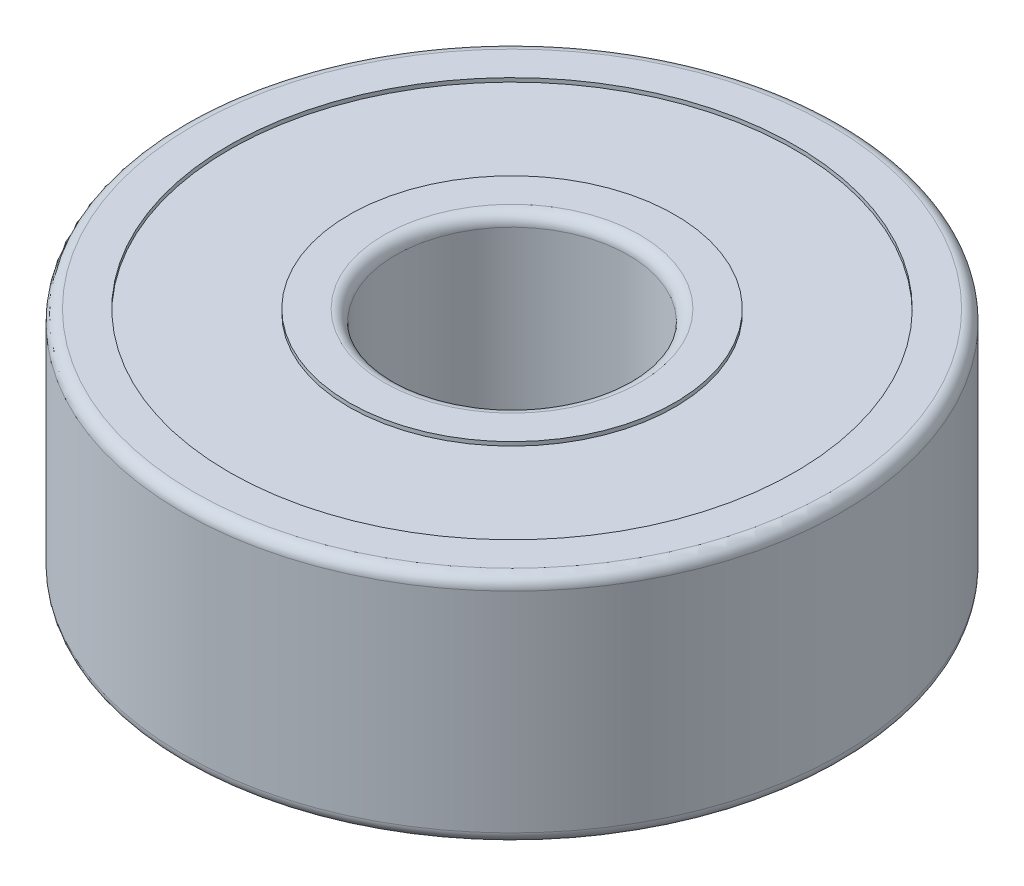
ISO-10303-21;
HEADER;
FILE_DESCRIPTION(('STEP AP214'),'2;1');
FILE_NAME('part.step','',(''),(''),'','','');
FILE_SCHEMA(('AUTOMOTIVE_DESIGN { 1 0 10303 214 1 1 1 1 }'));
ENDSEC;
DATA;
#1=APPLICATION_CONTEXT('core data for automotive mechanical design processes');
#2=APPLICATION_PROTOCOL_DEFINITION('international standard','automotive_design',2000,#1);
#3=PRODUCT_CONTEXT('',#1,'mechanical');
#4=PRODUCT('Part','Part','',(#3));
#5=PRODUCT_RELATED_PRODUCT_CATEGORY('part','',(#4));
#6=PRODUCT_DEFINITION_FORMATION('','',#4);
#7=PRODUCT_DEFINITION_CONTEXT('part definition',#1,'design');
#8=PRODUCT_DEFINITION('design','',#6,#7);
#9=PRODUCT_DEFINITION_SHAPE('','',#8);
#10=(LENGTH_UNIT() NAMED_UNIT(*) SI_UNIT(.MILLI.,.METRE.));
#11=(NAMED_UNIT(*) PLANE_ANGLE_UNIT() SI_UNIT($,.RADIAN.));
#12=(NAMED_UNIT(*) SI_UNIT($,.STERADIAN.) SOLID_ANGLE_UNIT());
#13=UNCERTAINTY_MEASURE_WITH_UNIT(LENGTH_MEASURE(1.E-05),#10,'distance_accuracy_value','');
#14=(GEOMETRIC_REPRESENTATION_CONTEXT(3) GLOBAL_UNCERTAINTY_ASSIGNED_CONTEXT((#13)) GLOBAL_UNIT_ASSIGNED_CONTEXT((#10,
#11,#12)) REPRESENTATION_CONTEXT('',''));
#15=CARTESIAN_POINT('',(0.,0.,0.));
#16=DIRECTION('',(0.,0.,1.));
#17=DIRECTION('',(1.,0.,0.));
#18=AXIS2_PLACEMENT_3D('',#15,#16,#17);
#19=CARTESIAN_POINT('',(0.,0.,0.));
#20=DIRECTION('',(0.,1.,0.));
#21=DIRECTION('',(0.,0.,1.));
#22=AXIS2_PLACEMENT_3D('',#19,#20,#21);
#23=PLANE('',#22);
#24=CARTESIAN_POINT('',(0.,0.,0.));
#25=DIRECTION('',(0.,1.,0.));
#26=DIRECTION('',(0.,0.,1.));
#27=AXIS2_PLACEMENT_3D('',#24,#25,#26);
#28=CIRCLE('',#27,3.3);
#29=CARTESIAN_POINT('',(0.,0.,3.3));
#30=VERTEX_POINT('',#29);
#31=EDGE_CURVE('E57',#30,#30,#28,.T.);
#32=ORIENTED_EDGE('',*,*,#31,.T.);
#33=EDGE_LOOP('',(#32));
#34=FACE_BOUND('',#33,.T.);
#35=CARTESIAN_POINT('',(0.,0.,0.));
#36=DIRECTION('',(0.,1.,0.));
#37=DIRECTION('',(0.,0.,1.));
#38=AXIS2_PLACEMENT_3D('',#35,#36,#37);
#39=CIRCLE('',#38,4.2);
#40=CARTESIAN_POINT('',(0.,0.,4.2));
#41=VERTEX_POINT('',#40);
#42=EDGE_CURVE('E88',#41,#41,#39,.T.);
#43=ORIENTED_EDGE('',*,*,#42,.F.);
#44=EDGE_LOOP('',(#43));
#45=FACE_BOUND('',#44,.T.);
#46=ADVANCED_FACE('F37',(#34,#45),#23,.F.);
#47=CARTESIAN_POINT('',(0.,6.,0.));
#48=DIRECTION('',(0.,1.,0.));
#49=DIRECTION('',(0.,0.,1.));
#50=AXIS2_PLACEMENT_3D('',#47,#48,#49);
#51=PLANE('',#50);
#52=CARTESIAN_POINT('',(0.,6.,0.));
#53=DIRECTION('',(0.,1.,0.));
#54=DIRECTION('',(0.,0.,1.));
#55=AXIS2_PLACEMENT_3D('',#52,#53,#54);
#56=CIRCLE('',#55,3.3);
#57=CARTESIAN_POINT('',(0.,6.,3.3));
#58=VERTEX_POINT('',#57);
#59=EDGE_CURVE('E60',#58,#58,#56,.F.);
#60=ORIENTED_EDGE('',*,*,#59,.T.);
#61=EDGE_LOOP('',(#60));
#62=FACE_BOUND('',#61,.T.);
#63=CARTESIAN_POINT('',(0.,6.,0.));
#64=DIRECTION('',(0.,1.,0.));
#65=DIRECTION('',(0.,0.,1.));
#66=AXIS2_PLACEMENT_3D('',#63,#64,#65);
#67=CIRCLE('',#66,4.2);
#68=CARTESIAN_POINT('',(0.,6.,4.2));
#69=VERTEX_POINT('',#68);
#70=EDGE_CURVE('E76',#69,#69,#67,.T.);
#71=ORIENTED_EDGE('',*,*,#70,.T.);
#72=EDGE_LOOP('',(#71));
#73=FACE_BOUND('',#72,.T.);
#74=ADVANCED_FACE('F105',(#62,#73),#51,.T.);
#75=CARTESIAN_POINT('',(0.,6.,0.));
#76=DIRECTION('',(0.,1.,0.));
#77=DIRECTION('',(0.,0.,1.));
#78=AXIS2_PLACEMENT_3D('',#75,#76,#77);
#79=CIRCLE('',#78,8.2);
#80=CARTESIAN_POINT('',(0.,6.,8.2));
#81=VERTEX_POINT('',#80);
#82=EDGE_CURVE('E10',#81,#81,#79,.T.);
#83=ORIENTED_EDGE('',*,*,#82,.T.);
#84=EDGE_LOOP('',(#83));
#85=FACE_BOUND('',#84,.T.);
#86=CARTESIAN_POINT('',(0.,6.,0.));
#87=DIRECTION('',(0.,1.,0.));
#88=DIRECTION('',(0.,0.,1.));
#89=AXIS2_PLACEMENT_3D('',#86,#87,#88);
#90=CIRCLE('',#89,7.3);
#91=CARTESIAN_POINT('',(0.,6.,7.3));
#92=VERTEX_POINT('',#91);
#93=EDGE_CURVE('E70',#92,#92,#90,.T.);
#94=ORIENTED_EDGE('',*,*,#93,.F.);
#95=EDGE_LOOP('',(#94));
#96=FACE_BOUND('',#95,.T.);
#97=ADVANCED_FACE('F112',(#85,#96),#51,.T.);
#98=CARTESIAN_POINT('',(0.,0.,0.));
#99=DIRECTION('',(0.,1.,0.));
#100=DIRECTION('',(0.,0.,1.));
#101=AXIS2_PLACEMENT_3D('',#98,#99,#100);
#102=CIRCLE('',#101,8.2);
#103=CARTESIAN_POINT('',(0.,0.,8.2));
#104=VERTEX_POINT('',#103);
#105=EDGE_CURVE('E44',#104,#104,#102,.F.);
#106=ORIENTED_EDGE('',*,*,#105,.T.);
#107=EDGE_LOOP('',(#106));
#108=FACE_BOUND('',#107,.T.);
#109=CARTESIAN_POINT('',(0.,0.,0.));
#110=DIRECTION('',(0.,1.,0.));
#111=DIRECTION('',(0.,0.,1.));
#112=AXIS2_PLACEMENT_3D('',#109,#110,#111);
#113=CIRCLE('',#112,7.3);
#114=CARTESIAN_POINT('',(0.,0.,7.3));
#115=VERTEX_POINT('',#114);
#116=EDGE_CURVE('E82',#115,#115,#113,.T.);
#117=ORIENTED_EDGE('',*,*,#116,.T.);
#118=EDGE_LOOP('',(#117));
#119=FACE_BOUND('',#118,.T.);
#120=ADVANCED_FACE('F108',(#108,#119),#23,.F.);
#121=CARTESIAN_POINT('',(0.,6.,0.));
#122=DIRECTION('',(0.,-1.,0.));
#123=DIRECTION('',(0.,0.,-1.));
#124=AXIS2_PLACEMENT_3D('',#121,#122,#123);
#125=CYLINDRICAL_SURFACE('',#124,8.5);
#126=CARTESIAN_POINT('',(0.,0.3,0.));
#127=DIRECTION('',(0.,1.,0.));
#128=DIRECTION('',(0.,0.,1.));
#129=AXIS2_PLACEMENT_3D('',#126,#127,#128);
#130=CIRCLE('',#129,8.5);
#131=CARTESIAN_POINT('',(0.,0.3,8.5));
#132=VERTEX_POINT('',#131);
#133=EDGE_CURVE('E48',#132,#132,#130,.T.);
#134=ORIENTED_EDGE('',*,*,#133,.T.);
#135=EDGE_LOOP('',(#134));
#136=FACE_BOUND('',#135,.T.);
#137=CARTESIAN_POINT('',(0.,5.7,0.));
#138=DIRECTION('',(0.,1.,0.));
#139=DIRECTION('',(0.,0.,1.));
#140=AXIS2_PLACEMENT_3D('',#137,#138,#139);
#141=CIRCLE('',#140,8.5);
#142=CARTESIAN_POINT('',(0.,5.7,8.5));
#143=VERTEX_POINT('',#142);
#144=EDGE_CURVE('E52',#143,#143,#141,.F.);
#145=ORIENTED_EDGE('',*,*,#144,.T.);
#146=EDGE_LOOP('',(#145));
#147=FACE_BOUND('',#146,.T.);
#148=ADVANCED_FACE('F117',(#136,#147),#125,.T.);
#149=CARTESIAN_POINT('',(0.,6.,0.));
#150=DIRECTION('',(0.,-1.,0.));
#151=DIRECTION('',(0.,0.,-1.));
#152=AXIS2_PLACEMENT_3D('',#149,#150,#151);
#153=CYLINDRICAL_SURFACE('',#152,3.);
#154=CARTESIAN_POINT('',(0.,5.7,0.));
#155=DIRECTION('',(0.,1.,0.));
#156=DIRECTION('',(0.,0.,1.));
#157=AXIS2_PLACEMENT_3D('',#154,#155,#156);
#158=CIRCLE('',#157,3.);
#159=CARTESIAN_POINT('',(0.,5.7,3.));
#160=VERTEX_POINT('',#159);
#161=EDGE_CURVE('E63',#160,#160,#158,.T.);
#162=ORIENTED_EDGE('',*,*,#161,.T.);
#163=EDGE_LOOP('',(#162));
#164=FACE_BOUND('',#163,.T.);
#165=CARTESIAN_POINT('',(0.,0.3,0.));
#166=DIRECTION('',(0.,1.,0.));
#167=DIRECTION('',(0.,0.,1.));
#168=AXIS2_PLACEMENT_3D('',#165,#166,#167);
#169=CIRCLE('',#168,3.);
#170=CARTESIAN_POINT('',(0.,0.3,3.));
#171=VERTEX_POINT('',#170);
#172=EDGE_CURVE('E66',#171,#171,#169,.F.);
#173=ORIENTED_EDGE('',*,*,#172,.T.);
#174=EDGE_LOOP('',(#173));
#175=FACE_BOUND('',#174,.T.);
#176=ADVANCED_FACE('F122',(#164,#175),#153,.F.);
#177=CARTESIAN_POINT('',(0.,5.9,0.));
#178=DIRECTION('',(0.,1.,0.));
#179=DIRECTION('',(0.,0.,1.));
#180=AXIS2_PLACEMENT_3D('',#177,#178,#179);
#181=CYLINDRICAL_SURFACE('',#180,7.3);
#182=CARTESIAN_POINT('',(0.,5.9,0.));
#183=DIRECTION('',(0.,1.,0.));
#184=DIRECTION('',(0.,0.,1.));
#185=AXIS2_PLACEMENT_3D('',#182,#183,#184);
#186=CIRCLE('',#185,7.3);
#187=CARTESIAN_POINT('',(0.,5.9,7.3));
#188=VERTEX_POINT('',#187);
#189=EDGE_CURVE('E69',#188,#188,#186,.T.);
#190=ORIENTED_EDGE('',*,*,#189,.F.);
#191=EDGE_LOOP('',(#190));
#192=FACE_BOUND('',#191,.T.);
#193=ORIENTED_EDGE('',*,*,#93,.T.);
#194=EDGE_LOOP('',(#193));
#195=FACE_BOUND('',#194,.T.);
#196=ADVANCED_FACE('F143',(#192,#195),#181,.F.);
#197=CARTESIAN_POINT('',(0.,5.9,0.));
#198=DIRECTION('',(0.,1.,0.));
#199=DIRECTION('',(0.,0.,1.));
#200=AXIS2_PLACEMENT_3D('',#197,#198,#199);
#201=PLANE('',#200);
#202=CARTESIAN_POINT('',(0.,5.9,0.));
#203=DIRECTION('',(0.,1.,0.));
#204=DIRECTION('',(0.,0.,1.));
#205=AXIS2_PLACEMENT_3D('',#202,#203,#204);
#206=CIRCLE('',#205,4.2);
#207=CARTESIAN_POINT('',(0.,5.9,4.2));
#208=VERTEX_POINT('',#207);
#209=EDGE_CURVE('E73',#208,#208,#206,.T.);
#210=ORIENTED_EDGE('',*,*,#209,.F.);
#211=EDGE_LOOP('',(#210));
#212=FACE_BOUND('',#211,.T.);
#213=ORIENTED_EDGE('',*,*,#189,.T.);
#214=EDGE_LOOP('',(#213));
#215=FACE_BOUND('',#214,.T.);
#216=ADVANCED_FACE('F139',(#212,#215),#201,.T.);
#217=CARTESIAN_POINT('',(0.,5.9,0.));
#218=DIRECTION('',(0.,1.,0.));
#219=DIRECTION('',(0.,0.,1.));
#220=AXIS2_PLACEMENT_3D('',#217,#218,#219);
#221=CYLINDRICAL_SURFACE('',#220,4.2);
#222=ORIENTED_EDGE('',*,*,#209,.T.);
#223=EDGE_LOOP('',(#222));
#224=FACE_BOUND('',#223,.T.);
#225=ORIENTED_EDGE('',*,*,#70,.F.);
#226=EDGE_LOOP('',(#225));
#227=FACE_BOUND('',#226,.T.);
#228=ADVANCED_FACE('F133',(#224,#227),#221,.T.);
#229=CARTESIAN_POINT('',(0.,0.1,0.));
#230=DIRECTION('',(0.,-1.,0.));
#231=DIRECTION('',(0.,0.,1.));
#232=AXIS2_PLACEMENT_3D('',#229,#230,#231);
#233=PLANE('',#232);
#234=CARTESIAN_POINT('',(0.,0.1,0.));
#235=DIRECTION('',(0.,1.,0.));
#236=DIRECTION('',(0.,0.,1.));
#237=AXIS2_PLACEMENT_3D('',#234,#235,#236);
#238=CIRCLE('',#237,7.3);
#239=CARTESIAN_POINT('',(0.,0.1,7.3));
#240=VERTEX_POINT('',#239);
#241=EDGE_CURVE('E79',#240,#240,#238,.T.);
#242=ORIENTED_EDGE('',*,*,#241,.F.);
#243=EDGE_LOOP('',(#242));
#244=FACE_BOUND('',#243,.T.);
#245=CARTESIAN_POINT('',(0.,0.1,0.));
#246=DIRECTION('',(0.,1.,0.));
#247=DIRECTION('',(0.,0.,1.));
#248=AXIS2_PLACEMENT_3D('',#245,#246,#247);
#249=CIRCLE('',#248,4.2);
#250=CARTESIAN_POINT('',(0.,0.1,4.2));
#251=VERTEX_POINT('',#250);
#252=EDGE_CURVE('E85',#251,#251,#249,.T.);
#253=ORIENTED_EDGE('',*,*,#252,.T.);
#254=EDGE_LOOP('',(#253));
#255=FACE_BOUND('',#254,.T.);
#256=ADVANCED_FACE('F94',(#244,#255),#233,.T.);
#257=CARTESIAN_POINT('',(0.,0.1,0.));
#258=DIRECTION('',(0.,-1.,0.));
#259=DIRECTION('',(0.,0.,-1.));
#260=AXIS2_PLACEMENT_3D('',#257,#258,#259);
#261=CYLINDRICAL_SURFACE('',#260,7.3);
#262=ORIENTED_EDGE('',*,*,#241,.T.);
#263=EDGE_LOOP('',(#262));
#264=FACE_BOUND('',#263,.T.);
#265=ORIENTED_EDGE('',*,*,#116,.F.);
#266=EDGE_LOOP('',(#265));
#267=FACE_BOUND('',#266,.T.);
#268=ADVANCED_FACE('F100',(#264,#267),#261,.F.);
#269=CARTESIAN_POINT('',(0.,0.1,0.));
#270=DIRECTION('',(0.,-1.,0.));
#271=DIRECTION('',(0.,0.,-1.));
#272=AXIS2_PLACEMENT_3D('',#269,#270,#271);
#273=CYLINDRICAL_SURFACE('',#272,4.2);
#274=ORIENTED_EDGE('',*,*,#252,.F.);
#275=EDGE_LOOP('',(#274));
#276=FACE_BOUND('',#275,.T.);
#277=ORIENTED_EDGE('',*,*,#42,.T.);
#278=EDGE_LOOP('',(#277));
#279=FACE_BOUND('',#278,.T.);
#280=ADVANCED_FACE('F96',(#276,#279),#273,.T.);
#281=CARTESIAN_POINT('',(0.,5.7,0.));
#282=DIRECTION('',(0.,1.,0.));
#283=DIRECTION('',(0.,0.,1.));
#284=AXIS2_PLACEMENT_3D('',#281,#282,#283);
#285=TOROIDAL_SURFACE('',#284,3.3,0.3);
#286=ORIENTED_EDGE('',*,*,#59,.F.);
#287=EDGE_LOOP('',(#286));
#288=FACE_BOUND('',#287,.T.);
#289=ORIENTED_EDGE('',*,*,#161,.F.);
#290=EDGE_LOOP('',(#289));
#291=FACE_BOUND('',#290,.T.);
#292=ADVANCED_FACE('F99',(#288,#291),#285,.T.);
#293=CARTESIAN_POINT('',(0.,0.3,0.));
#294=DIRECTION('',(0.,1.,0.));
#295=DIRECTION('',(0.,0.,1.));
#296=AXIS2_PLACEMENT_3D('',#293,#294,#295);
#297=TOROIDAL_SURFACE('',#296,3.3,0.3);
#298=ORIENTED_EDGE('',*,*,#172,.F.);
#299=EDGE_LOOP('',(#298));
#300=FACE_BOUND('',#299,.T.);
#301=ORIENTED_EDGE('',*,*,#31,.F.);
#302=EDGE_LOOP('',(#301));
#303=FACE_BOUND('',#302,.T.);
#304=ADVANCED_FACE('F156',(#300,#303),#297,.T.);
#305=CARTESIAN_POINT('',(0.,0.3,0.));
#306=DIRECTION('',(0.,1.,0.));
#307=DIRECTION('',(0.,0.,1.));
#308=AXIS2_PLACEMENT_3D('',#305,#306,#307);
#309=TOROIDAL_SURFACE('',#308,8.2,0.3);
#310=ORIENTED_EDGE('',*,*,#105,.F.);
#311=EDGE_LOOP('',(#310));
#312=FACE_BOUND('',#311,.T.);
#313=ORIENTED_EDGE('',*,*,#133,.F.);
#314=EDGE_LOOP('',(#313));
#315=FACE_BOUND('',#314,.T.);
#316=ADVANCED_FACE('F159',(#312,#315),#309,.T.);
#317=CARTESIAN_POINT('',(0.,5.7,0.));
#318=DIRECTION('',(0.,1.,0.));
#319=DIRECTION('',(0.,0.,1.));
#320=AXIS2_PLACEMENT_3D('',#317,#318,#319);
#321=TOROIDAL_SURFACE('',#320,8.2,0.3);
#322=ORIENTED_EDGE('',*,*,#144,.F.);
#323=EDGE_LOOP('',(#322));
#324=FACE_BOUND('',#323,.T.);
#325=ORIENTED_EDGE('',*,*,#82,.F.);
#326=EDGE_LOOP('',(#325));
#327=FACE_BOUND('',#326,.T.);
#328=ADVANCED_FACE('F39',(#324,#327),#321,.T.);
#329=CLOSED_SHELL('',(#46,#74,#97,#120,#148,#176,#196,#216,#228,#256,#268,#280,#292,#304,#316,#328));
#330=MANIFOLD_SOLID_BREP('B2',#329);
#331=ADVANCED_BREP_SHAPE_REPRESENTATION('',(#18,#330),#14);
#332=SHAPE_DEFINITION_REPRESENTATION(#9,#331);
ENDSEC;
END-ISO-10303-21;
